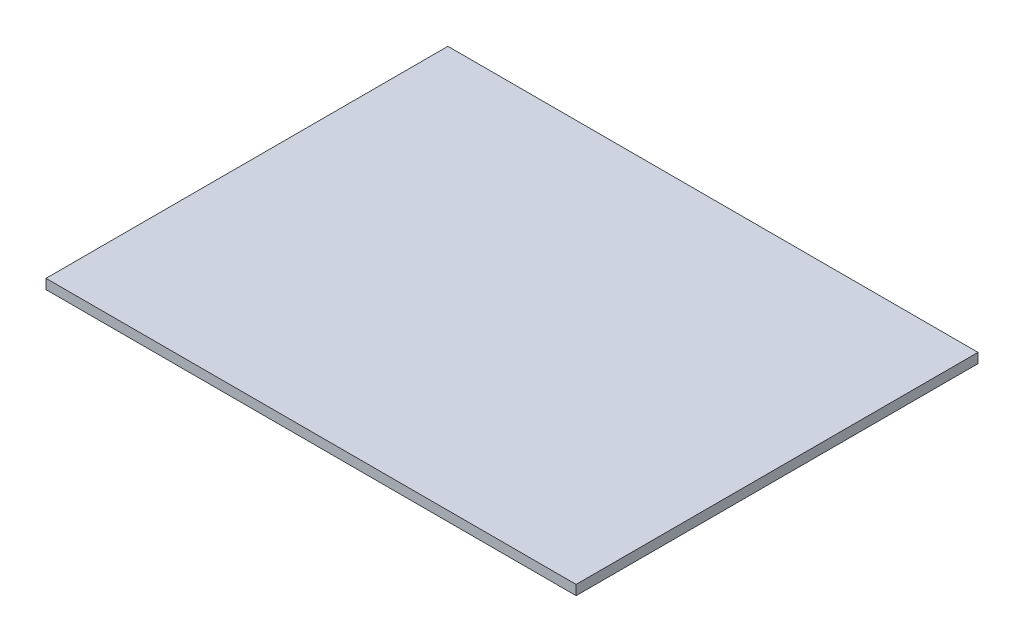
ISO-10303-21;
HEADER;
FILE_DESCRIPTION(('STEP AP214'),'2;1');
FILE_NAME('part.step','',(''),(''),'','','');
FILE_SCHEMA(('AUTOMOTIVE_DESIGN { 1 0 10303 214 1 1 1 1 }'));
ENDSEC;
DATA;
#1=APPLICATION_CONTEXT('core data for automotive mechanical design processes');
#2=APPLICATION_PROTOCOL_DEFINITION('international standard','automotive_design',2000,#1);
#3=PRODUCT_CONTEXT('',#1,'mechanical');
#4=PRODUCT('Part','Part','',(#3));
#5=PRODUCT_RELATED_PRODUCT_CATEGORY('part','',(#4));
#6=PRODUCT_DEFINITION_FORMATION('','',#4);
#7=PRODUCT_DEFINITION_CONTEXT('part definition',#1,'design');
#8=PRODUCT_DEFINITION('design','',#6,#7);
#9=PRODUCT_DEFINITION_SHAPE('','',#8);
#10=(LENGTH_UNIT() NAMED_UNIT(*) SI_UNIT(.MILLI.,.METRE.));
#11=(NAMED_UNIT(*) PLANE_ANGLE_UNIT() SI_UNIT($,.RADIAN.));
#12=(NAMED_UNIT(*) SI_UNIT($,.STERADIAN.) SOLID_ANGLE_UNIT());
#13=UNCERTAINTY_MEASURE_WITH_UNIT(LENGTH_MEASURE(1.E-05),#10,'distance_accuracy_value','');
#14=(GEOMETRIC_REPRESENTATION_CONTEXT(3) GLOBAL_UNCERTAINTY_ASSIGNED_CONTEXT((#13)) GLOBAL_UNIT_ASSIGNED_CONTEXT((#10,
#11,#12)) REPRESENTATION_CONTEXT('',''));
#15=CARTESIAN_POINT('',(0.,0.,0.));
#16=DIRECTION('',(0.,0.,1.));
#17=DIRECTION('',(1.,0.,0.));
#18=AXIS2_PLACEMENT_3D('',#15,#16,#17);
#19=CARTESIAN_POINT('',(405.6,15.,307.5));
#20=DIRECTION('',(-1.,0.,0.));
#21=DIRECTION('',(0.,0.,1.));
#22=AXIS2_PLACEMENT_3D('',#19,#20,#21);
#23=PLANE('',#22);
#24=DIRECTION('',(0.,0.,-1.));
#25=VECTOR('',#24,1.);
#26=CARTESIAN_POINT('',(405.6,0.,307.5));
#27=LINE('',#26,#25);
#28=CARTESIAN_POINT('',(405.6,0.,307.5));
#29=VERTEX_POINT('',#28);
#30=CARTESIAN_POINT('',(405.6,0.,-307.5));
#31=VERTEX_POINT('',#30);
#32=EDGE_CURVE('E95',#29,#31,#27,.T.);
#33=ORIENTED_EDGE('',*,*,#32,.T.);
#34=DIRECTION('',(0.,-1.,0.));
#35=VECTOR('',#34,1.);
#36=CARTESIAN_POINT('',(405.6,15.,-307.5));
#37=LINE('',#36,#35);
#38=CARTESIAN_POINT('',(405.6,15.,-307.5));
#39=VERTEX_POINT('',#38);
#40=EDGE_CURVE('E11',#39,#31,#37,.T.);
#41=ORIENTED_EDGE('',*,*,#40,.F.);
#42=DIRECTION('',(0.,0.,-1.));
#43=VECTOR('',#42,1.);
#44=CARTESIAN_POINT('',(405.6,15.,307.5));
#45=LINE('',#44,#43);
#46=CARTESIAN_POINT('',(405.6,15.,307.5));
#47=VERTEX_POINT('',#46);
#48=EDGE_CURVE('E83',#47,#39,#45,.T.);
#49=ORIENTED_EDGE('',*,*,#48,.F.);
#50=DIRECTION('',(0.,-1.,0.));
#51=VECTOR('',#50,1.);
#52=CARTESIAN_POINT('',(405.6,15.,307.5));
#53=LINE('',#52,#51);
#54=EDGE_CURVE('E91',#47,#29,#53,.T.);
#55=ORIENTED_EDGE('',*,*,#54,.T.);
#56=EDGE_LOOP('',(#33,#41,#49,#55));
#57=FACE_BOUND('',#56,.T.);
#58=ADVANCED_FACE('F32',(#57),#23,.F.);
#59=CARTESIAN_POINT('',(-405.6,15.,-307.5));
#60=DIRECTION('',(0.,0.,1.));
#61=DIRECTION('',(1.,0.,0.));
#62=AXIS2_PLACEMENT_3D('',#59,#60,#61);
#63=PLANE('',#62);
#64=DIRECTION('',(-1.,0.,0.));
#65=VECTOR('',#64,1.);
#66=CARTESIAN_POINT('',(-405.6,0.,-307.5));
#67=LINE('',#66,#65);
#68=CARTESIAN_POINT('',(-405.6,0.,-307.5));
#69=VERTEX_POINT('',#68);
#70=EDGE_CURVE('E87',#31,#69,#67,.T.);
#71=ORIENTED_EDGE('',*,*,#70,.T.);
#72=DIRECTION('',(0.,-1.,0.));
#73=VECTOR('',#72,1.);
#74=CARTESIAN_POINT('',(-405.6,15.,-307.5));
#75=LINE('',#74,#73);
#76=CARTESIAN_POINT('',(-405.6,15.,-307.5));
#77=VERTEX_POINT('',#76);
#78=EDGE_CURVE('E40',#77,#69,#75,.T.);
#79=ORIENTED_EDGE('',*,*,#78,.F.);
#80=DIRECTION('',(-1.,0.,0.));
#81=VECTOR('',#80,1.);
#82=CARTESIAN_POINT('',(-405.6,15.,-307.5));
#83=LINE('',#82,#81);
#84=EDGE_CURVE('E78',#39,#77,#83,.T.);
#85=ORIENTED_EDGE('',*,*,#84,.F.);
#86=ORIENTED_EDGE('',*,*,#40,.T.);
#87=EDGE_LOOP('',(#71,#79,#85,#86));
#88=FACE_BOUND('',#87,.T.);
#89=ADVANCED_FACE('F86',(#88),#63,.F.);
#90=CARTESIAN_POINT('',(-405.6,15.,307.5));
#91=DIRECTION('',(1.,0.,0.));
#92=DIRECTION('',(0.,0.,-1.));
#93=AXIS2_PLACEMENT_3D('',#90,#91,#92);
#94=PLANE('',#93);
#95=DIRECTION('',(0.,0.,1.));
#96=VECTOR('',#95,1.);
#97=CARTESIAN_POINT('',(-405.6,0.,307.5));
#98=LINE('',#97,#96);
#99=CARTESIAN_POINT('',(-405.6,0.,307.5));
#100=VERTEX_POINT('',#99);
#101=EDGE_CURVE('E65',#69,#100,#98,.T.);
#102=ORIENTED_EDGE('',*,*,#101,.T.);
#103=DIRECTION('',(0.,-1.,0.));
#104=VECTOR('',#103,1.);
#105=CARTESIAN_POINT('',(-405.6,15.,307.5));
#106=LINE('',#105,#104);
#107=CARTESIAN_POINT('',(-405.6,15.,307.5));
#108=VERTEX_POINT('',#107);
#109=EDGE_CURVE('E88',#108,#100,#106,.T.);
#110=ORIENTED_EDGE('',*,*,#109,.F.);
#111=DIRECTION('',(0.,0.,1.));
#112=VECTOR('',#111,1.);
#113=CARTESIAN_POINT('',(-405.6,15.,307.5));
#114=LINE('',#113,#112);
#115=EDGE_CURVE('E81',#77,#108,#114,.T.);
#116=ORIENTED_EDGE('',*,*,#115,.F.);
#117=ORIENTED_EDGE('',*,*,#78,.T.);
#118=EDGE_LOOP('',(#102,#110,#116,#117));
#119=FACE_BOUND('',#118,.T.);
#120=ADVANCED_FACE('F89',(#119),#94,.F.);
#121=CARTESIAN_POINT('',(-405.6,15.,307.5));
#122=DIRECTION('',(0.,0.,-1.));
#123=DIRECTION('',(-1.,0.,0.));
#124=AXIS2_PLACEMENT_3D('',#121,#122,#123);
#125=PLANE('',#124);
#126=DIRECTION('',(1.,0.,0.));
#127=VECTOR('',#126,1.);
#128=CARTESIAN_POINT('',(-405.6,0.,307.5));
#129=LINE('',#128,#127);
#130=EDGE_CURVE('E71',#100,#29,#129,.T.);
#131=ORIENTED_EDGE('',*,*,#130,.T.);
#132=ORIENTED_EDGE('',*,*,#54,.F.);
#133=DIRECTION('',(1.,0.,0.));
#134=VECTOR('',#133,1.);
#135=CARTESIAN_POINT('',(-405.6,15.,307.5));
#136=LINE('',#135,#134);
#137=EDGE_CURVE('E48',#108,#47,#136,.T.);
#138=ORIENTED_EDGE('',*,*,#137,.F.);
#139=ORIENTED_EDGE('',*,*,#109,.T.);
#140=EDGE_LOOP('',(#131,#132,#138,#139));
#141=FACE_BOUND('',#140,.T.);
#142=ADVANCED_FACE('F102',(#141),#125,.F.);
#143=CARTESIAN_POINT('',(0.,15.,0.));
#144=DIRECTION('',(0.,-1.,0.));
#145=DIRECTION('',(0.,0.,-1.));
#146=AXIS2_PLACEMENT_3D('',#143,#144,#145);
#147=PLANE('',#146);
#148=ORIENTED_EDGE('',*,*,#48,.T.);
#149=ORIENTED_EDGE('',*,*,#84,.T.);
#150=ORIENTED_EDGE('',*,*,#115,.T.);
#151=ORIENTED_EDGE('',*,*,#137,.T.);
#152=EDGE_LOOP('',(#148,#149,#150,#151));
#153=FACE_BOUND('',#152,.T.);
#154=ADVANCED_FACE('F79',(#153),#147,.F.);
#155=CARTESIAN_POINT('',(0.,0.,0.));
#156=DIRECTION('',(0.,-1.,0.));
#157=DIRECTION('',(0.,0.,-1.));
#158=AXIS2_PLACEMENT_3D('',#155,#156,#157);
#159=PLANE('',#158);
#160=ORIENTED_EDGE('',*,*,#32,.F.);
#161=ORIENTED_EDGE('',*,*,#130,.F.);
#162=ORIENTED_EDGE('',*,*,#101,.F.);
#163=ORIENTED_EDGE('',*,*,#70,.F.);
#164=EDGE_LOOP('',(#160,#161,#162,#163));
#165=FACE_BOUND('',#164,.T.);
#166=ADVANCED_FACE('F105',(#165),#159,.T.);
#167=CLOSED_SHELL('',(#58,#89,#120,#142,#154,#166));
#168=MANIFOLD_SOLID_BREP('B2',#167);
#169=ADVANCED_BREP_SHAPE_REPRESENTATION('',(#18,#168),#14);
#170=SHAPE_DEFINITION_REPRESENTATION(#9,#169);
ENDSEC;
END-ISO-10303-21;
